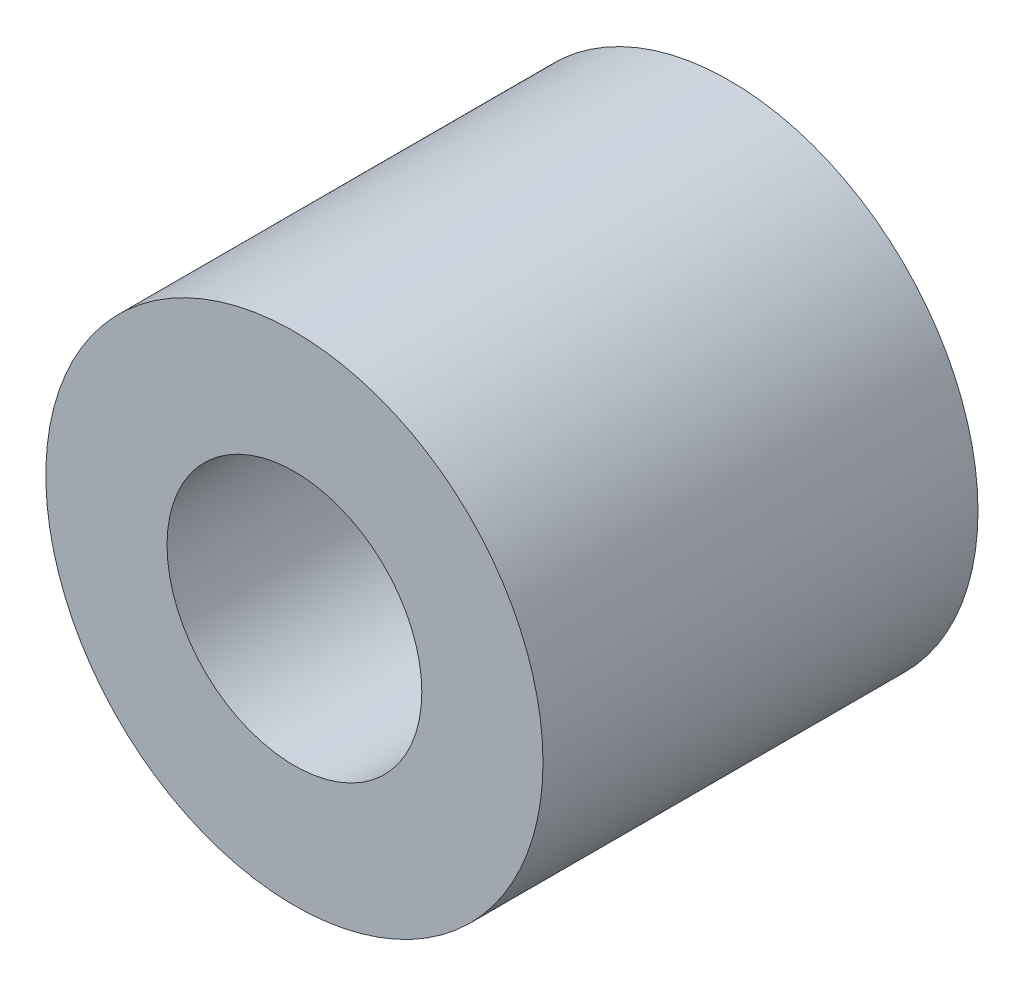
ISO-10303-21;
HEADER;
FILE_DESCRIPTION(('STEP AP214'),'2;1');
FILE_NAME('part.step','',(''),(''),'','','');
FILE_SCHEMA(('AUTOMOTIVE_DESIGN { 1 0 10303 214 1 1 1 1 }'));
ENDSEC;
DATA;
#1=APPLICATION_CONTEXT('core data for automotive mechanical design processes');
#2=APPLICATION_PROTOCOL_DEFINITION('international standard','automotive_design',2000,#1);
#3=PRODUCT_CONTEXT('',#1,'mechanical');
#4=PRODUCT('Part','Part','',(#3));
#5=PRODUCT_RELATED_PRODUCT_CATEGORY('part','',(#4));
#6=PRODUCT_DEFINITION_FORMATION('','',#4);
#7=PRODUCT_DEFINITION_CONTEXT('part definition',#1,'design');
#8=PRODUCT_DEFINITION('design','',#6,#7);
#9=PRODUCT_DEFINITION_SHAPE('','',#8);
#10=(LENGTH_UNIT() NAMED_UNIT(*) SI_UNIT(.MILLI.,.METRE.));
#11=(NAMED_UNIT(*) PLANE_ANGLE_UNIT() SI_UNIT($,.RADIAN.));
#12=(NAMED_UNIT(*) SI_UNIT($,.STERADIAN.) SOLID_ANGLE_UNIT());
#13=UNCERTAINTY_MEASURE_WITH_UNIT(LENGTH_MEASURE(1.E-05),#10,'distance_accuracy_value','');
#14=(GEOMETRIC_REPRESENTATION_CONTEXT(3) GLOBAL_UNCERTAINTY_ASSIGNED_CONTEXT((#13)) GLOBAL_UNIT_ASSIGNED_CONTEXT((#10,
#11,#12)) REPRESENTATION_CONTEXT('',''));
#15=CARTESIAN_POINT('',(0.,0.,0.));
#16=DIRECTION('',(0.,0.,1.));
#17=DIRECTION('',(1.,0.,0.));
#18=AXIS2_PLACEMENT_3D('',#15,#16,#17);
#19=CARTESIAN_POINT('',(0.,0.,7.));
#20=DIRECTION('',(0.,0.,1.));
#21=DIRECTION('',(1.,0.,0.));
#22=AXIS2_PLACEMENT_3D('',#19,#20,#21);
#23=PLANE('',#22);
#24=CARTESIAN_POINT('',(0.,0.,7.));
#25=DIRECTION('',(0.,0.,1.));
#26=DIRECTION('',(1.,0.,0.));
#27=AXIS2_PLACEMENT_3D('',#24,#25,#26);
#28=CIRCLE('',#27,4.);
#29=CARTESIAN_POINT('',(4.,0.,7.));
#30=VERTEX_POINT('',#29);
#31=EDGE_CURVE('E10',#30,#30,#28,.T.);
#32=ORIENTED_EDGE('',*,*,#31,.T.);
#33=EDGE_LOOP('',(#32));
#34=FACE_BOUND('',#33,.T.);
#35=CARTESIAN_POINT('',(0.,0.,7.));
#36=DIRECTION('',(0.,0.,1.));
#37=DIRECTION('',(1.,0.,0.));
#38=AXIS2_PLACEMENT_3D('',#35,#36,#37);
#39=CIRCLE('',#38,2.05);
#40=CARTESIAN_POINT('',(2.05,0.,7.));
#41=VERTEX_POINT('',#40);
#42=EDGE_CURVE('E50',#41,#41,#39,.T.);
#43=ORIENTED_EDGE('',*,*,#42,.F.);
#44=EDGE_LOOP('',(#43));
#45=FACE_BOUND('',#44,.T.);
#46=ADVANCED_FACE('F37',(#34,#45),#23,.T.);
#47=CARTESIAN_POINT('',(0.,0.,0.));
#48=DIRECTION('',(0.,0.,1.));
#49=DIRECTION('',(1.,0.,0.));
#50=AXIS2_PLACEMENT_3D('',#47,#48,#49);
#51=PLANE('',#50);
#52=CARTESIAN_POINT('',(0.,0.,0.));
#53=DIRECTION('',(0.,0.,1.));
#54=DIRECTION('',(1.,0.,0.));
#55=AXIS2_PLACEMENT_3D('',#52,#53,#54);
#56=CIRCLE('',#55,4.);
#57=CARTESIAN_POINT('',(4.,0.,0.));
#58=VERTEX_POINT('',#57);
#59=EDGE_CURVE('E41',#58,#58,#56,.T.);
#60=ORIENTED_EDGE('',*,*,#59,.F.);
#61=EDGE_LOOP('',(#60));
#62=FACE_BOUND('',#61,.T.);
#63=CARTESIAN_POINT('',(0.,0.,0.));
#64=DIRECTION('',(0.,0.,1.));
#65=DIRECTION('',(1.,0.,0.));
#66=AXIS2_PLACEMENT_3D('',#63,#64,#65);
#67=CIRCLE('',#66,2.05);
#68=CARTESIAN_POINT('',(2.05,0.,0.));
#69=VERTEX_POINT('',#68);
#70=EDGE_CURVE('E52',#69,#69,#67,.T.);
#71=ORIENTED_EDGE('',*,*,#70,.T.);
#72=EDGE_LOOP('',(#71));
#73=FACE_BOUND('',#72,.T.);
#74=ADVANCED_FACE('F64',(#62,#73),#51,.F.);
#75=CARTESIAN_POINT('',(0.,0.,7.));
#76=DIRECTION('',(0.,0.,-1.));
#77=DIRECTION('',(-1.,0.,0.));
#78=AXIS2_PLACEMENT_3D('',#75,#76,#77);
#79=CYLINDRICAL_SURFACE('',#78,4.);
#80=ORIENTED_EDGE('',*,*,#31,.F.);
#81=EDGE_LOOP('',(#80));
#82=FACE_BOUND('',#81,.T.);
#83=ORIENTED_EDGE('',*,*,#59,.T.);
#84=EDGE_LOOP('',(#83));
#85=FACE_BOUND('',#84,.T.);
#86=ADVANCED_FACE('F39',(#82,#85),#79,.T.);
#87=CARTESIAN_POINT('',(0.,0.,7.));
#88=DIRECTION('',(0.,0.,-1.));
#89=DIRECTION('',(-1.,0.,0.));
#90=AXIS2_PLACEMENT_3D('',#87,#88,#89);
#91=CYLINDRICAL_SURFACE('',#90,2.05);
#92=ORIENTED_EDGE('',*,*,#42,.T.);
#93=EDGE_LOOP('',(#92));
#94=FACE_BOUND('',#93,.T.);
#95=ORIENTED_EDGE('',*,*,#70,.F.);
#96=EDGE_LOOP('',(#95));
#97=FACE_BOUND('',#96,.T.);
#98=ADVANCED_FACE('F60',(#94,#97),#91,.F.);
#99=CLOSED_SHELL('',(#46,#74,#86,#98));
#100=MANIFOLD_SOLID_BREP('B2',#99);
#101=ADVANCED_BREP_SHAPE_REPRESENTATION('',(#18,#100),#14);
#102=SHAPE_DEFINITION_REPRESENTATION(#9,#101);
ENDSEC;
END-ISO-10303-21;
